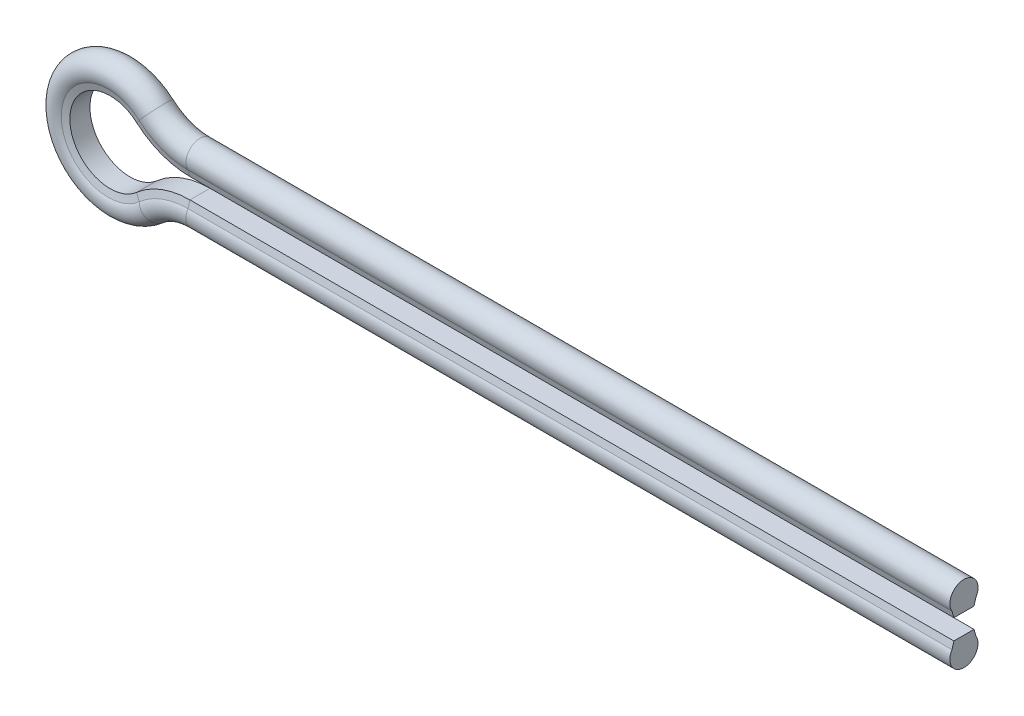
ISO-10303-21;
HEADER;
FILE_DESCRIPTION(('STEP AP214'),'2;1');
FILE_NAME('part.step','',(''),(''),'','','');
FILE_SCHEMA(('AUTOMOTIVE_DESIGN { 1 0 10303 214 1 1 1 1 }'));
ENDSEC;
DATA;
#1=APPLICATION_CONTEXT('core data for automotive mechanical design processes');
#2=APPLICATION_PROTOCOL_DEFINITION('international standard','automotive_design',2000,#1);
#3=PRODUCT_CONTEXT('',#1,'mechanical');
#4=PRODUCT('Part','Part','',(#3));
#5=PRODUCT_RELATED_PRODUCT_CATEGORY('part','',(#4));
#6=PRODUCT_DEFINITION_FORMATION('','',#4);
#7=PRODUCT_DEFINITION_CONTEXT('part definition',#1,'design');
#8=PRODUCT_DEFINITION('design','',#6,#7);
#9=PRODUCT_DEFINITION_SHAPE('','',#8);
#10=(LENGTH_UNIT() NAMED_UNIT(*) SI_UNIT(.MILLI.,.METRE.));
#11=(NAMED_UNIT(*) PLANE_ANGLE_UNIT() SI_UNIT($,.RADIAN.));
#12=(NAMED_UNIT(*) SI_UNIT($,.STERADIAN.) SOLID_ANGLE_UNIT());
#13=UNCERTAINTY_MEASURE_WITH_UNIT(LENGTH_MEASURE(1.E-05),#10,'distance_accuracy_value','');
#14=(GEOMETRIC_REPRESENTATION_CONTEXT(3) GLOBAL_UNCERTAINTY_ASSIGNED_CONTEXT((#13)) GLOBAL_UNIT_ASSIGNED_CONTEXT((#10,
#11,#12)) REPRESENTATION_CONTEXT('',''));
#15=CARTESIAN_POINT('',(0.,0.,0.));
#16=DIRECTION('',(0.,0.,1.));
#17=DIRECTION('',(1.,0.,0.));
#18=AXIS2_PLACEMENT_3D('',#15,#16,#17);
#19=CARTESIAN_POINT('',(0.,-4.25,0.));
#20=DIRECTION('',(-1.,0.,0.));
#21=DIRECTION('',(0.,0.,-1.));
#22=AXIS2_PLACEMENT_3D('',#19,#20,#21);
#23=PLANE('',#22);
#24=DIRECTION('',(0.,-0.961523947640823,-0.274721127897378));
#25=VECTOR('',#24,1.);
#26=CARTESIAN_POINT('',(0.,-2.5,-1.25));
#27=LINE('',#26,#25);
#28=CARTESIAN_POINT('',(0.,-2.5,-1.25));
#29=VERTEX_POINT('',#28);
#30=CARTESIAN_POINT('',(0.,-3.32547169811321,-1.48584905660377));
#31=VERTEX_POINT('',#30);
#32=EDGE_CURVE('E152',#29,#31,#27,.T.);
#33=ORIENTED_EDGE('',*,*,#32,.F.);
#34=DIRECTION('',(0.,0.,-1.));
#35=VECTOR('',#34,1.);
#36=CARTESIAN_POINT('',(0.,-2.5,1.25));
#37=LINE('',#36,#35);
#38=CARTESIAN_POINT('',(0.,-2.5,1.25));
#39=VERTEX_POINT('',#38);
#40=EDGE_CURVE('E154',#39,#29,#37,.T.);
#41=ORIENTED_EDGE('',*,*,#40,.F.);
#42=DIRECTION('',(0.,0.961523947640823,-0.274721127897378));
#43=VECTOR('',#42,1.);
#44=CARTESIAN_POINT('',(0.,-2.5,1.25));
#45=LINE('',#44,#43);
#46=CARTESIAN_POINT('',(0.,-3.32547169811321,1.48584905660377));
#47=VERTEX_POINT('',#46);
#48=EDGE_CURVE('E173',#47,#39,#45,.T.);
#49=ORIENTED_EDGE('',*,*,#48,.F.);
#50=CARTESIAN_POINT('',(0.,-4.25,0.));
#51=DIRECTION('',(-1.,0.,0.));
#52=DIRECTION('',(0.,0.,-1.));
#53=AXIS2_PLACEMENT_3D('',#50,#51,#52);
#54=CIRCLE('',#53,1.75);
#55=EDGE_CURVE('E157',#31,#47,#54,.T.);
#56=ORIENTED_EDGE('',*,*,#55,.F.);
#57=EDGE_LOOP('',(#33,#41,#49,#56));
#58=FACE_BOUND('',#57,.T.);
#59=ADVANCED_FACE('F43',(#58),#23,.F.);
#60=CARTESIAN_POINT('',(0.,1.75,0.));
#61=DIRECTION('',(1.,0.,0.));
#62=DIRECTION('',(0.,0.,-1.));
#63=AXIS2_PLACEMENT_3D('',#60,#61,#62);
#64=PLANE('',#63);
#65=DIRECTION('',(0.,0.961523947640823,-0.274721127897378));
#66=VECTOR('',#65,1.);
#67=CARTESIAN_POINT('',(0.,0.,-1.25));
#68=LINE('',#67,#66);
#69=CARTESIAN_POINT('',(0.,0.,-1.25));
#70=VERTEX_POINT('',#69);
#71=CARTESIAN_POINT('',(0.,0.825471698113207,-1.48584905660377));
#72=VERTEX_POINT('',#71);
#73=EDGE_CURVE('E226',#70,#72,#68,.T.);
#74=ORIENTED_EDGE('',*,*,#73,.T.);
#75=CARTESIAN_POINT('',(0.,1.75,0.));
#76=DIRECTION('',(1.,0.,0.));
#77=DIRECTION('',(0.,0.,-1.));
#78=AXIS2_PLACEMENT_3D('',#75,#76,#77);
#79=CIRCLE('',#78,1.75);
#80=CARTESIAN_POINT('',(0.,0.825471698113207,1.48584905660377));
#81=VERTEX_POINT('',#80);
#82=EDGE_CURVE('E63',#72,#81,#79,.T.);
#83=ORIENTED_EDGE('',*,*,#82,.T.);
#84=DIRECTION('',(0.,-0.961523947640823,-0.274721127897378));
#85=VECTOR('',#84,1.);
#86=CARTESIAN_POINT('',(0.,0.,1.25));
#87=LINE('',#86,#85);
#88=CARTESIAN_POINT('',(0.,0.,1.25));
#89=VERTEX_POINT('',#88);
#90=EDGE_CURVE('E57',#81,#89,#87,.T.);
#91=ORIENTED_EDGE('',*,*,#90,.T.);
#92=DIRECTION('',(0.,0.,-1.));
#93=VECTOR('',#92,1.);
#94=CARTESIAN_POINT('',(0.,0.,1.25));
#95=LINE('',#94,#93);
#96=EDGE_CURVE('E11',#89,#70,#95,.T.);
#97=ORIENTED_EDGE('',*,*,#96,.T.);
#98=EDGE_LOOP('',(#74,#83,#91,#97));
#99=FACE_BOUND('',#98,.T.);
#100=ADVANCED_FACE('F346',(#99),#64,.T.);
#101=CARTESIAN_POINT('',(0.,-2.5,-1.25));
#102=DIRECTION('',(0.,0.274721127897378,-0.961523947640823));
#103=DIRECTION('',(0.,0.961523947640823,0.274721127897378));
#104=AXIS2_PLACEMENT_3D('',#101,#102,#103);
#105=PLANE('',#104);
#106=DIRECTION('',(-1.,0.,0.));
#107=VECTOR('',#106,1.);
#108=CARTESIAN_POINT('',(0.,-3.32547169811321,-1.48584905660377));
#109=LINE('',#108,#107);
#110=CARTESIAN_POINT('',(-94.9196617662671,-3.32547169811321,-1.48584905660377));
#111=VERTEX_POINT('',#110);
#112=EDGE_CURVE('E182',#31,#111,#109,.T.);
#113=ORIENTED_EDGE('',*,*,#112,.T.);
#114=DIRECTION('',(0.,-0.961523947640823,-0.274721127897378));
#115=VECTOR('',#114,1.);
#116=CARTESIAN_POINT('',(-94.9196617662671,-2.5,-1.25));
#117=LINE('',#116,#115);
#118=CARTESIAN_POINT('',(-94.9196617662671,-2.5,-1.25));
#119=VERTEX_POINT('',#118);
#120=EDGE_CURVE('E178',#119,#111,#117,.T.);
#121=ORIENTED_EDGE('',*,*,#120,.F.);
#122=DIRECTION('',(-1.,0.,0.));
#123=VECTOR('',#122,1.);
#124=CARTESIAN_POINT('',(0.,-2.5,-1.25));
#125=LINE('',#124,#123);
#126=EDGE_CURVE('E169',#29,#119,#125,.T.);
#127=ORIENTED_EDGE('',*,*,#126,.F.);
#128=ORIENTED_EDGE('',*,*,#32,.T.);
#129=EDGE_LOOP('',(#113,#121,#127,#128));
#130=FACE_BOUND('',#129,.T.);
#131=ADVANCED_FACE('F176',(#130),#105,.T.);
#132=CARTESIAN_POINT('',(0.,-4.25,0.));
#133=DIRECTION('',(-1.,0.,0.));
#134=DIRECTION('',(0.,-1.,0.));
#135=AXIS2_PLACEMENT_3D('',#132,#133,#134);
#136=CYLINDRICAL_SURFACE('',#135,1.75);
#137=DIRECTION('',(-1.,0.,0.));
#138=VECTOR('',#137,1.);
#139=CARTESIAN_POINT('',(0.,-3.32547169811321,1.48584905660377));
#140=LINE('',#139,#138);
#141=CARTESIAN_POINT('',(-94.9196617662671,-3.32547169811321,1.48584905660377));
#142=VERTEX_POINT('',#141);
#143=EDGE_CURVE('E242',#47,#142,#140,.T.);
#144=ORIENTED_EDGE('',*,*,#143,.T.);
#145=CARTESIAN_POINT('',(-94.9196617662671,-4.25,0.));
#146=DIRECTION('',(-1.,0.,0.));
#147=DIRECTION('',(0.,0.,-1.));
#148=AXIS2_PLACEMENT_3D('',#145,#146,#147);
#149=CIRCLE('',#148,1.75);
#150=EDGE_CURVE('E238',#111,#142,#149,.T.);
#151=ORIENTED_EDGE('',*,*,#150,.F.);
#152=ORIENTED_EDGE('',*,*,#112,.F.);
#153=ORIENTED_EDGE('',*,*,#55,.T.);
#154=EDGE_LOOP('',(#144,#151,#152,#153));
#155=FACE_BOUND('',#154,.T.);
#156=ADVANCED_FACE('F373',(#155),#136,.T.);
#157=CARTESIAN_POINT('',(0.,-2.5,1.25));
#158=DIRECTION('',(0.,0.274721127897378,0.961523947640823));
#159=DIRECTION('',(0.,-0.961523947640823,0.274721127897378));
#160=AXIS2_PLACEMENT_3D('',#157,#158,#159);
#161=PLANE('',#160);
#162=DIRECTION('',(-1.,0.,0.));
#163=VECTOR('',#162,1.);
#164=CARTESIAN_POINT('',(0.,-2.5,1.25));
#165=LINE('',#164,#163);
#166=CARTESIAN_POINT('',(-94.9196617662671,-2.5,1.25));
#167=VERTEX_POINT('',#166);
#168=EDGE_CURVE('E171',#39,#167,#165,.T.);
#169=ORIENTED_EDGE('',*,*,#168,.T.);
#170=DIRECTION('',(0.,0.961523947640823,-0.274721127897378));
#171=VECTOR('',#170,1.);
#172=CARTESIAN_POINT('',(-94.9196617662671,-2.5,1.25));
#173=LINE('',#172,#171);
#174=EDGE_CURVE('E246',#142,#167,#173,.T.);
#175=ORIENTED_EDGE('',*,*,#174,.F.);
#176=ORIENTED_EDGE('',*,*,#143,.F.);
#177=ORIENTED_EDGE('',*,*,#48,.T.);
#178=EDGE_LOOP('',(#169,#175,#176,#177));
#179=FACE_BOUND('',#178,.T.);
#180=ADVANCED_FACE('F331',(#179),#161,.T.);
#181=CARTESIAN_POINT('',(0.,-2.5,1.25));
#182=DIRECTION('',(0.,1.,0.));
#183=DIRECTION('',(-1.,0.,0.));
#184=AXIS2_PLACEMENT_3D('',#181,#182,#183);
#185=PLANE('',#184);
#186=DIRECTION('',(0.,0.,-1.));
#187=VECTOR('',#186,1.);
#188=CARTESIAN_POINT('',(-94.9196617662671,-2.5,1.25));
#189=LINE('',#188,#187);
#190=EDGE_CURVE('E199',#167,#119,#189,.T.);
#191=ORIENTED_EDGE('',*,*,#190,.F.);
#192=ORIENTED_EDGE('',*,*,#168,.F.);
#193=ORIENTED_EDGE('',*,*,#40,.T.);
#194=ORIENTED_EDGE('',*,*,#126,.T.);
#195=EDGE_LOOP('',(#191,#192,#193,#194));
#196=FACE_BOUND('',#195,.T.);
#197=ADVANCED_FACE('F168',(#196),#185,.T.);
#198=CARTESIAN_POINT('',(-94.9196617662671,-12.5,-1.25));
#199=DIRECTION('',(0.,0.,1.));
#200=DIRECTION('',(1.,0.,0.));
#201=AXIS2_PLACEMENT_3D('',#198,#199,#200);
#202=CONICAL_SURFACE('',#201,10.,1.29249666778979);
#203=CARTESIAN_POINT('',(-94.9196617662671,-12.5,-1.48584905660377));
#204=DIRECTION('',(0.,0.,1.));
#205=DIRECTION('',(0.,1.,0.));
#206=AXIS2_PLACEMENT_3D('',#203,#204,#205);
#207=CIRCLE('',#206,9.1745283018868);
#208=CARTESIAN_POINT('',(-100.988041837046,-5.6191037735849,-1.48584905660377));
#209=VERTEX_POINT('',#208);
#210=EDGE_CURVE('E190',#111,#209,#207,.T.);
#211=ORIENTED_EDGE('',*,*,#210,.T.);
#212=DIRECTION('',(0.635988311272676,-0.721142960730618,-0.274721127897378));
#213=VECTOR('',#212,1.);
#214=CARTESIAN_POINT('',(-101.534040043929,-5.00000000000001,-1.25));
#215=LINE('',#214,#213);
#216=CARTESIAN_POINT('',(-101.534040043929,-5.,-1.25));
#217=VERTEX_POINT('',#216);
#218=EDGE_CURVE('E186',#217,#209,#215,.T.);
#219=ORIENTED_EDGE('',*,*,#218,.F.);
#220=CARTESIAN_POINT('',(-94.9196617662671,-12.5,-1.25));
#221=DIRECTION('',(0.,0.,1.));
#222=DIRECTION('',(0.,1.,0.));
#223=AXIS2_PLACEMENT_3D('',#220,#221,#222);
#224=CIRCLE('',#223,10.);
#225=EDGE_CURVE('E191',#119,#217,#224,.T.);
#226=ORIENTED_EDGE('',*,*,#225,.F.);
#227=ORIENTED_EDGE('',*,*,#120,.T.);
#228=EDGE_LOOP('',(#211,#219,#226,#227));
#229=FACE_BOUND('',#228,.T.);
#230=ADVANCED_FACE('F327',(#229),#202,.T.);
#231=CARTESIAN_POINT('',(-94.9196617662671,-12.5,0.));
#232=DIRECTION('',(0.,0.,1.));
#233=DIRECTION('',(1.,0.,0.));
#234=AXIS2_PLACEMENT_3D('',#231,#232,#233);
#235=TOROIDAL_SURFACE('',#234,8.25,1.75);
#236=CARTESIAN_POINT('',(-94.9196617662671,-12.5,1.48584905660377));
#237=DIRECTION('',(0.,0.,1.));
#238=DIRECTION('',(0.,1.,0.));
#239=AXIS2_PLACEMENT_3D('',#236,#237,#238);
#240=CIRCLE('',#239,9.1745283018868);
#241=CARTESIAN_POINT('',(-100.988041837046,-5.6191037735849,1.48584905660377));
#242=VERTEX_POINT('',#241);
#243=EDGE_CURVE('E250',#142,#242,#240,.T.);
#244=ORIENTED_EDGE('',*,*,#243,.T.);
#245=CARTESIAN_POINT('',(-100.376523845338,-6.31250000000001,0.));
#246=DIRECTION('',(-0.750000000000001,-0.661437827766147,0.));
#247=DIRECTION('',(0.,0.,-1.));
#248=AXIS2_PLACEMENT_3D('',#245,#246,#247);
#249=CIRCLE('',#248,1.75);
#250=EDGE_CURVE('E195',#209,#242,#249,.T.);
#251=ORIENTED_EDGE('',*,*,#250,.F.);
#252=ORIENTED_EDGE('',*,*,#210,.F.);
#253=ORIENTED_EDGE('',*,*,#150,.T.);
#254=EDGE_LOOP('',(#244,#251,#252,#253));
#255=FACE_BOUND('',#254,.T.);
#256=ADVANCED_FACE('F338',(#255),#235,.T.);
#257=CARTESIAN_POINT('',(-94.9196617662671,-12.5,1.48584905660377));
#258=DIRECTION('',(0.,0.,-1.));
#259=DIRECTION('',(-1.,0.,0.));
#260=AXIS2_PLACEMENT_3D('',#257,#258,#259);
#261=CONICAL_SURFACE('',#260,9.1745283018868,1.29249666778979);
#262=CARTESIAN_POINT('',(-94.9196617662671,-12.5,1.25));
#263=DIRECTION('',(0.,0.,1.));
#264=DIRECTION('',(0.,1.,0.));
#265=AXIS2_PLACEMENT_3D('',#262,#263,#264);
#266=CIRCLE('',#265,10.);
#267=CARTESIAN_POINT('',(-101.534040043929,-5.,1.25));
#268=VERTEX_POINT('',#267);
#269=EDGE_CURVE('E281',#167,#268,#266,.T.);
#270=ORIENTED_EDGE('',*,*,#269,.T.);
#271=DIRECTION('',(-0.635988311272676,0.721142960730618,-0.274721127897378));
#272=VECTOR('',#271,1.);
#273=CARTESIAN_POINT('',(-101.534040043929,-5.00000000000001,1.25));
#274=LINE('',#273,#272);
#275=EDGE_CURVE('E254',#242,#268,#274,.T.);
#276=ORIENTED_EDGE('',*,*,#275,.F.);
#277=ORIENTED_EDGE('',*,*,#243,.F.);
#278=ORIENTED_EDGE('',*,*,#174,.T.);
#279=EDGE_LOOP('',(#270,#276,#277,#278));
#280=FACE_BOUND('',#279,.T.);
#281=ADVANCED_FACE('F334',(#280),#261,.T.);
#282=CARTESIAN_POINT('',(-94.9196617662671,-12.5,0.));
#283=DIRECTION('',(0.,0.,1.));
#284=DIRECTION('',(1.,0.,0.));
#285=AXIS2_PLACEMENT_3D('',#282,#283,#284);
#286=CYLINDRICAL_SURFACE('',#285,10.);
#287=DIRECTION('',(0.,0.,-1.));
#288=VECTOR('',#287,1.);
#289=CARTESIAN_POINT('',(-101.534040043929,-5.00000000000001,1.25));
#290=LINE('',#289,#288);
#291=EDGE_CURVE('E213',#268,#217,#290,.T.);
#292=ORIENTED_EDGE('',*,*,#291,.F.);
#293=ORIENTED_EDGE('',*,*,#269,.F.);
#294=ORIENTED_EDGE('',*,*,#190,.T.);
#295=ORIENTED_EDGE('',*,*,#225,.T.);
#296=EDGE_LOOP('',(#292,#293,#294,#295));
#297=FACE_BOUND('',#296,.T.);
#298=ADVANCED_FACE('F328',(#297),#286,.T.);
#299=CARTESIAN_POINT('',(-104.841229182759,-1.25000000000001,-1.25));
#300=DIRECTION('',(0.,0.,-1.));
#301=DIRECTION('',(-1.,0.,0.));
#302=AXIS2_PLACEMENT_3D('',#299,#300,#301);
#303=CONICAL_SURFACE('',#302,5.,1.29249666778979);
#304=CARTESIAN_POINT('',(-104.841229182759,-1.25000000000001,-1.48584905660377));
#305=DIRECTION('',(0.,0.,-1.));
#306=DIRECTION('',(0.661437827766148,-0.75,0.));
#307=AXIS2_PLACEMENT_3D('',#304,#305,#306);
#308=CIRCLE('',#307,5.82547169811321);
#309=CARTESIAN_POINT('',(-100.988041837046,3.11910377358489,-1.48584905660377));
#310=VERTEX_POINT('',#309);
#311=EDGE_CURVE('E204',#209,#310,#308,.T.);
#312=ORIENTED_EDGE('',*,*,#311,.T.);
#313=DIRECTION('',(0.635988311272677,0.721142960730618,-0.274721127897378));
#314=VECTOR('',#313,1.);
#315=CARTESIAN_POINT('',(-101.534040043929,2.49999999999999,-1.25));
#316=LINE('',#315,#314);
#317=CARTESIAN_POINT('',(-101.534040043929,2.49999999999999,-1.25));
#318=VERTEX_POINT('',#317);
#319=EDGE_CURVE('E200',#318,#310,#316,.T.);
#320=ORIENTED_EDGE('',*,*,#319,.F.);
#321=CARTESIAN_POINT('',(-104.841229182759,-1.25000000000001,-1.25));
#322=DIRECTION('',(0.,0.,-1.));
#323=DIRECTION('',(0.661437827766148,-0.75,0.));
#324=AXIS2_PLACEMENT_3D('',#321,#322,#323);
#325=CIRCLE('',#324,5.);
#326=EDGE_CURVE('E205',#217,#318,#325,.T.);
#327=ORIENTED_EDGE('',*,*,#326,.F.);
#328=ORIENTED_EDGE('',*,*,#218,.T.);
#329=EDGE_LOOP('',(#312,#320,#327,#328));
#330=FACE_BOUND('',#329,.T.);
#331=ADVANCED_FACE('F321',(#330),#303,.F.);
#332=CARTESIAN_POINT('',(-104.841229182759,-1.25000000000001,0.));
#333=DIRECTION('',(0.,0.,-1.));
#334=DIRECTION('',(-1.,0.,0.));
#335=AXIS2_PLACEMENT_3D('',#332,#333,#334);
#336=TOROIDAL_SURFACE('',#335,6.75,1.75);
#337=CARTESIAN_POINT('',(-104.841229182759,-1.25000000000001,1.48584905660377));
#338=DIRECTION('',(0.,0.,-1.));
#339=DIRECTION('',(0.661437827766148,-0.75,0.));
#340=AXIS2_PLACEMENT_3D('',#337,#338,#339);
#341=CIRCLE('',#340,5.82547169811321);
#342=CARTESIAN_POINT('',(-100.988041837046,3.11910377358489,1.48584905660377));
#343=VERTEX_POINT('',#342);
#344=EDGE_CURVE('E257',#242,#343,#341,.T.);
#345=ORIENTED_EDGE('',*,*,#344,.T.);
#346=CARTESIAN_POINT('',(-100.376523845338,3.81249999999999,0.));
#347=DIRECTION('',(0.75,-0.661437827766148,0.));
#348=DIRECTION('',(0.,0.,-1.));
#349=AXIS2_PLACEMENT_3D('',#346,#347,#348);
#350=CIRCLE('',#349,1.75);
#351=EDGE_CURVE('E209',#310,#343,#350,.T.);
#352=ORIENTED_EDGE('',*,*,#351,.F.);
#353=ORIENTED_EDGE('',*,*,#311,.F.);
#354=ORIENTED_EDGE('',*,*,#250,.T.);
#355=EDGE_LOOP('',(#345,#352,#353,#354));
#356=FACE_BOUND('',#355,.T.);
#357=ADVANCED_FACE('F341',(#356),#336,.T.);
#358=CARTESIAN_POINT('',(-104.841229182759,-1.25000000000001,1.48584905660377));
#359=DIRECTION('',(0.,0.,1.));
#360=DIRECTION('',(1.,0.,0.));
#361=AXIS2_PLACEMENT_3D('',#358,#359,#360);
#362=CONICAL_SURFACE('',#361,5.82547169811321,1.29249666778979);
#363=CARTESIAN_POINT('',(-104.841229182759,-1.25000000000001,1.25));
#364=DIRECTION('',(0.,0.,-1.));
#365=DIRECTION('',(0.661437827766148,-0.75,0.));
#366=AXIS2_PLACEMENT_3D('',#363,#364,#365);
#367=CIRCLE('',#366,5.);
#368=CARTESIAN_POINT('',(-101.534040043929,2.49999999999999,1.25));
#369=VERTEX_POINT('',#368);
#370=EDGE_CURVE('E287',#268,#369,#367,.T.);
#371=ORIENTED_EDGE('',*,*,#370,.T.);
#372=DIRECTION('',(-0.635988311272677,-0.721142960730617,-0.274721127897378));
#373=VECTOR('',#372,1.);
#374=CARTESIAN_POINT('',(-101.534040043929,2.49999999999999,1.25));
#375=LINE('',#374,#373);
#376=EDGE_CURVE('E261',#343,#369,#375,.T.);
#377=ORIENTED_EDGE('',*,*,#376,.F.);
#378=ORIENTED_EDGE('',*,*,#344,.F.);
#379=ORIENTED_EDGE('',*,*,#275,.T.);
#380=EDGE_LOOP('',(#371,#377,#378,#379));
#381=FACE_BOUND('',#380,.T.);
#382=ADVANCED_FACE('F350',(#381),#362,.F.);
#383=CARTESIAN_POINT('',(-104.841229182759,-1.25000000000001,0.));
#384=DIRECTION('',(0.,0.,-1.));
#385=DIRECTION('',(-1.,0.,0.));
#386=AXIS2_PLACEMENT_3D('',#383,#384,#385);
#387=CYLINDRICAL_SURFACE('',#386,5.);
#388=DIRECTION('',(0.,0.,-1.));
#389=VECTOR('',#388,1.);
#390=CARTESIAN_POINT('',(-101.534040043929,2.49999999999999,1.25));
#391=LINE('',#390,#389);
#392=EDGE_CURVE('E225',#369,#318,#391,.T.);
#393=ORIENTED_EDGE('',*,*,#392,.F.);
#394=ORIENTED_EDGE('',*,*,#370,.F.);
#395=ORIENTED_EDGE('',*,*,#291,.T.);
#396=ORIENTED_EDGE('',*,*,#326,.T.);
#397=EDGE_LOOP('',(#393,#394,#395,#396));
#398=FACE_BOUND('',#397,.T.);
#399=ADVANCED_FACE('F322',(#398),#387,.F.);
#400=CARTESIAN_POINT('',(-94.9196617662671,9.99999999999999,-1.25));
#401=DIRECTION('',(0.,0.,1.));
#402=DIRECTION('',(1.,0.,0.));
#403=AXIS2_PLACEMENT_3D('',#400,#401,#402);
#404=CONICAL_SURFACE('',#403,9.99999999999999,1.29249666778979);
#405=CARTESIAN_POINT('',(-94.9196617662671,9.99999999999999,-1.48584905660377));
#406=DIRECTION('',(0.,0.,1.));
#407=DIRECTION('',(-0.661437827766147,-0.75,0.));
#408=AXIS2_PLACEMENT_3D('',#405,#406,#407);
#409=CIRCLE('',#408,9.17452830188678);
#410=CARTESIAN_POINT('',(-94.9196617662671,0.825471698113206,-1.48584905660377));
#411=VERTEX_POINT('',#410);
#412=EDGE_CURVE('E133',#310,#411,#409,.T.);
#413=ORIENTED_EDGE('',*,*,#412,.T.);
#414=DIRECTION('',(0.,0.961523947640823,-0.274721127897378));
#415=VECTOR('',#414,1.);
#416=CARTESIAN_POINT('',(-94.9196617662671,0.,-1.25));
#417=LINE('',#416,#415);
#418=CARTESIAN_POINT('',(-94.9196617662671,0.,-1.25));
#419=VERTEX_POINT('',#418);
#420=EDGE_CURVE('E214',#419,#411,#417,.T.);
#421=ORIENTED_EDGE('',*,*,#420,.F.);
#422=CARTESIAN_POINT('',(-94.9196617662671,9.99999999999999,-1.25));
#423=DIRECTION('',(0.,0.,1.));
#424=DIRECTION('',(-0.661437827766147,-0.75,0.));
#425=AXIS2_PLACEMENT_3D('',#422,#423,#424);
#426=CIRCLE('',#425,9.99999999999999);
#427=EDGE_CURVE('E218',#318,#419,#426,.T.);
#428=ORIENTED_EDGE('',*,*,#427,.F.);
#429=ORIENTED_EDGE('',*,*,#319,.T.);
#430=EDGE_LOOP('',(#413,#421,#428,#429));
#431=FACE_BOUND('',#430,.T.);
#432=ADVANCED_FACE('F314',(#431),#404,.T.);
#433=CARTESIAN_POINT('',(-94.9196617662671,9.99999999999999,0.));
#434=DIRECTION('',(0.,0.,1.));
#435=DIRECTION('',(1.,0.,0.));
#436=AXIS2_PLACEMENT_3D('',#433,#434,#435);
#437=TOROIDAL_SURFACE('',#436,8.24999999999999,1.75);
#438=CARTESIAN_POINT('',(-94.9196617662671,9.99999999999999,1.48584905660377));
#439=DIRECTION('',(0.,0.,1.));
#440=DIRECTION('',(-0.661437827766147,-0.75,0.));
#441=AXIS2_PLACEMENT_3D('',#438,#439,#440);
#442=CIRCLE('',#441,9.17452830188678);
#443=CARTESIAN_POINT('',(-94.9196617662671,0.825471698113206,1.48584905660377));
#444=VERTEX_POINT('',#443);
#445=EDGE_CURVE('E127',#343,#444,#442,.T.);
#446=ORIENTED_EDGE('',*,*,#445,.T.);
#447=CARTESIAN_POINT('',(-94.9196617662671,1.75,0.));
#448=DIRECTION('',(1.,0.,0.));
#449=DIRECTION('',(0.,0.,-1.));
#450=AXIS2_PLACEMENT_3D('',#447,#448,#449);
#451=CIRCLE('',#450,1.75);
#452=EDGE_CURVE('E221',#411,#444,#451,.T.);
#453=ORIENTED_EDGE('',*,*,#452,.F.);
#454=ORIENTED_EDGE('',*,*,#412,.F.);
#455=ORIENTED_EDGE('',*,*,#351,.T.);
#456=EDGE_LOOP('',(#446,#453,#454,#455));
#457=FACE_BOUND('',#456,.T.);
#458=ADVANCED_FACE('F342',(#457),#437,.T.);
#459=CARTESIAN_POINT('',(-94.9196617662671,9.99999999999999,1.48584905660377));
#460=DIRECTION('',(0.,0.,-1.));
#461=DIRECTION('',(-1.,0.,0.));
#462=AXIS2_PLACEMENT_3D('',#459,#460,#461);
#463=CONICAL_SURFACE('',#462,9.17452830188678,1.29249666778979);
#464=CARTESIAN_POINT('',(-94.9196617662671,9.99999999999999,1.25));
#465=DIRECTION('',(0.,0.,1.));
#466=DIRECTION('',(-0.661437827766147,-0.75,0.));
#467=AXIS2_PLACEMENT_3D('',#464,#465,#466);
#468=CIRCLE('',#467,9.99999999999999);
#469=CARTESIAN_POINT('',(-94.9196617662671,0.,1.25));
#470=VERTEX_POINT('',#469);
#471=EDGE_CURVE('E293',#369,#470,#468,.T.);
#472=ORIENTED_EDGE('',*,*,#471,.T.);
#473=DIRECTION('',(0.,-0.961523947640823,-0.274721127897378));
#474=VECTOR('',#473,1.);
#475=CARTESIAN_POINT('',(-94.9196617662671,0.,1.25));
#476=LINE('',#475,#474);
#477=EDGE_CURVE('E266',#444,#470,#476,.T.);
#478=ORIENTED_EDGE('',*,*,#477,.F.);
#479=ORIENTED_EDGE('',*,*,#445,.F.);
#480=ORIENTED_EDGE('',*,*,#376,.T.);
#481=EDGE_LOOP('',(#472,#478,#479,#480));
#482=FACE_BOUND('',#481,.T.);
#483=ADVANCED_FACE('F348',(#482),#463,.T.);
#484=CARTESIAN_POINT('',(-94.9196617662671,9.99999999999999,0.));
#485=DIRECTION('',(0.,0.,1.));
#486=DIRECTION('',(1.,0.,0.));
#487=AXIS2_PLACEMENT_3D('',#484,#485,#486);
#488=CYLINDRICAL_SURFACE('',#487,9.99999999999999);
#489=DIRECTION('',(0.,0.,-1.));
#490=VECTOR('',#489,1.);
#491=CARTESIAN_POINT('',(-94.9196617662671,0.,1.25));
#492=LINE('',#491,#490);
#493=EDGE_CURVE('E235',#470,#419,#492,.T.);
#494=ORIENTED_EDGE('',*,*,#493,.F.);
#495=ORIENTED_EDGE('',*,*,#471,.F.);
#496=ORIENTED_EDGE('',*,*,#392,.T.);
#497=ORIENTED_EDGE('',*,*,#427,.T.);
#498=EDGE_LOOP('',(#494,#495,#496,#497));
#499=FACE_BOUND('',#498,.T.);
#500=ADVANCED_FACE('F316',(#499),#488,.T.);
#501=CARTESIAN_POINT('',(-94.9196617662671,0.,-1.25));
#502=DIRECTION('',(0.,-0.274721127897378,-0.961523947640823));
#503=DIRECTION('',(0.,0.961523947640823,-0.274721127897378));
#504=AXIS2_PLACEMENT_3D('',#501,#502,#503);
#505=PLANE('',#504);
#506=DIRECTION('',(1.,0.,0.));
#507=VECTOR('',#506,1.);
#508=CARTESIAN_POINT('',(-94.9196617662671,0.825471698113207,-1.48584905660377));
#509=LINE('',#508,#507);
#510=EDGE_CURVE('E108',#411,#72,#509,.T.);
#511=ORIENTED_EDGE('',*,*,#510,.T.);
#512=ORIENTED_EDGE('',*,*,#73,.F.);
#513=DIRECTION('',(1.,0.,0.));
#514=VECTOR('',#513,1.);
#515=CARTESIAN_POINT('',(-94.9196617662671,0.,-1.25));
#516=LINE('',#515,#514);
#517=EDGE_CURVE('E229',#419,#70,#516,.T.);
#518=ORIENTED_EDGE('',*,*,#517,.F.);
#519=ORIENTED_EDGE('',*,*,#420,.T.);
#520=EDGE_LOOP('',(#511,#512,#518,#519));
#521=FACE_BOUND('',#520,.T.);
#522=ADVANCED_FACE('F345',(#521),#505,.T.);
#523=CARTESIAN_POINT('',(-94.9196617662671,1.75,0.));
#524=DIRECTION('',(1.,0.,0.));
#525=DIRECTION('',(0.,0.,-1.));
#526=AXIS2_PLACEMENT_3D('',#523,#524,#525);
#527=CYLINDRICAL_SURFACE('',#526,1.75);
#528=DIRECTION('',(1.,0.,0.));
#529=VECTOR('',#528,1.);
#530=CARTESIAN_POINT('',(-94.9196617662671,0.825471698113207,1.48584905660377));
#531=LINE('',#530,#529);
#532=EDGE_CURVE('E101',#444,#81,#531,.T.);
#533=ORIENTED_EDGE('',*,*,#532,.T.);
#534=ORIENTED_EDGE('',*,*,#82,.F.);
#535=ORIENTED_EDGE('',*,*,#510,.F.);
#536=ORIENTED_EDGE('',*,*,#452,.T.);
#537=EDGE_LOOP('',(#533,#534,#535,#536));
#538=FACE_BOUND('',#537,.T.);
#539=ADVANCED_FACE('F343',(#538),#527,.T.);
#540=CARTESIAN_POINT('',(-94.9196617662671,0.,1.25));
#541=DIRECTION('',(0.,-0.274721127897378,0.961523947640823));
#542=DIRECTION('',(0.,-0.961523947640823,-0.274721127897378));
#543=AXIS2_PLACEMENT_3D('',#540,#541,#542);
#544=PLANE('',#543);
#545=DIRECTION('',(1.,0.,0.));
#546=VECTOR('',#545,1.);
#547=CARTESIAN_POINT('',(-94.9196617662671,0.,1.25));
#548=LINE('',#547,#546);
#549=EDGE_CURVE('E51',#470,#89,#548,.T.);
#550=ORIENTED_EDGE('',*,*,#549,.T.);
#551=ORIENTED_EDGE('',*,*,#90,.F.);
#552=ORIENTED_EDGE('',*,*,#532,.F.);
#553=ORIENTED_EDGE('',*,*,#477,.T.);
#554=EDGE_LOOP('',(#550,#551,#552,#553));
#555=FACE_BOUND('',#554,.T.);
#556=ADVANCED_FACE('F347',(#555),#544,.T.);
#557=CARTESIAN_POINT('',(-94.9196617662671,0.,1.25));
#558=DIRECTION('',(0.,-1.,0.));
#559=DIRECTION('',(0.,0.,-1.));
#560=AXIS2_PLACEMENT_3D('',#557,#558,#559);
#561=PLANE('',#560);
#562=ORIENTED_EDGE('',*,*,#96,.F.);
#563=ORIENTED_EDGE('',*,*,#549,.F.);
#564=ORIENTED_EDGE('',*,*,#493,.T.);
#565=ORIENTED_EDGE('',*,*,#517,.T.);
#566=EDGE_LOOP('',(#562,#563,#564,#565));
#567=FACE_BOUND('',#566,.T.);
#568=ADVANCED_FACE('F311',(#567),#561,.T.);
#569=CLOSED_SHELL('',(#59,#100,#131,#156,#180,#197,#230,#256,#281,#298,#331,#357,#382,#399,#432,
#458,#483,#500,#522,#539,#556,#568));
#570=MANIFOLD_SOLID_BREP('B2',#569);
#571=ADVANCED_BREP_SHAPE_REPRESENTATION('',(#18,#570),#14);
#572=SHAPE_DEFINITION_REPRESENTATION(#9,#571);
ENDSEC;
END-ISO-10303-21;
